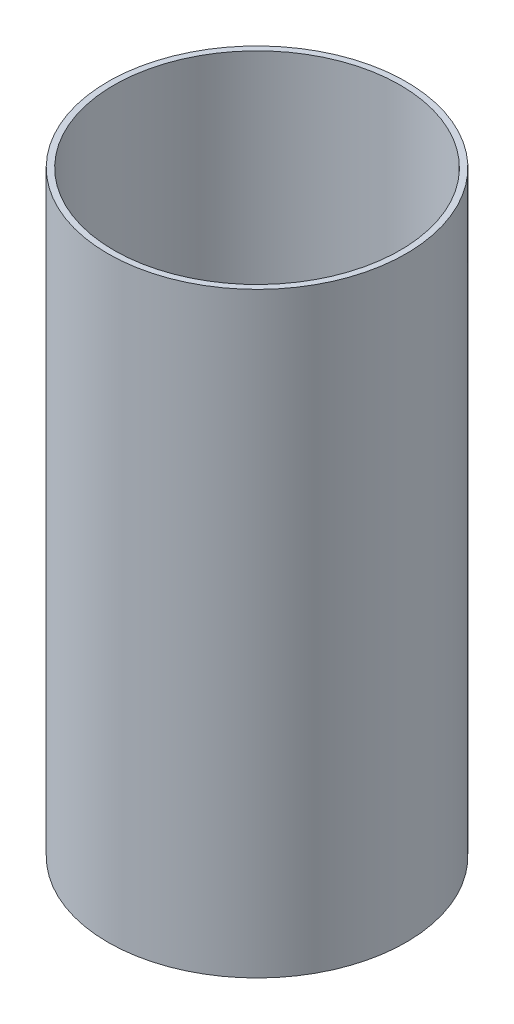
ISO-10303-21;
HEADER;
FILE_DESCRIPTION(('STEP AP214'),'2;1');
FILE_NAME('part.step','',(''),(''),'','','');
FILE_SCHEMA(('AUTOMOTIVE_DESIGN { 1 0 10303 214 1 1 1 1 }'));
ENDSEC;
DATA;
#1=APPLICATION_CONTEXT('core data for automotive mechanical design processes');
#2=APPLICATION_PROTOCOL_DEFINITION('international standard','automotive_design',2000,#1);
#3=PRODUCT_CONTEXT('',#1,'mechanical');
#4=PRODUCT('Part','Part','',(#3));
#5=PRODUCT_RELATED_PRODUCT_CATEGORY('part','',(#4));
#6=PRODUCT_DEFINITION_FORMATION('','',#4);
#7=PRODUCT_DEFINITION_CONTEXT('part definition',#1,'design');
#8=PRODUCT_DEFINITION('design','',#6,#7);
#9=PRODUCT_DEFINITION_SHAPE('','',#8);
#10=(LENGTH_UNIT() NAMED_UNIT(*) SI_UNIT(.MILLI.,.METRE.));
#11=(NAMED_UNIT(*) PLANE_ANGLE_UNIT() SI_UNIT($,.RADIAN.));
#12=(NAMED_UNIT(*) SI_UNIT($,.STERADIAN.) SOLID_ANGLE_UNIT());
#13=UNCERTAINTY_MEASURE_WITH_UNIT(LENGTH_MEASURE(1.E-05),#10,'distance_accuracy_value','');
#14=(GEOMETRIC_REPRESENTATION_CONTEXT(3) GLOBAL_UNCERTAINTY_ASSIGNED_CONTEXT((#13)) GLOBAL_UNIT_ASSIGNED_CONTEXT((#10,
#11,#12)) REPRESENTATION_CONTEXT('',''));
#15=CARTESIAN_POINT('',(0.,0.,0.));
#16=DIRECTION('',(0.,0.,1.));
#17=DIRECTION('',(1.,0.,0.));
#18=AXIS2_PLACEMENT_3D('',#15,#16,#17);
#19=CARTESIAN_POINT('',(0.,300.,0.));
#20=DIRECTION('',(0.,1.,0.));
#21=DIRECTION('',(0.,0.,1.));
#22=AXIS2_PLACEMENT_3D('',#19,#20,#21);
#23=PLANE('',#22);
#24=CARTESIAN_POINT('',(0.,300.,0.));
#25=DIRECTION('',(0.,1.,0.));
#26=DIRECTION('',(0.,0.,1.));
#27=AXIS2_PLACEMENT_3D('',#24,#25,#26);
#28=CIRCLE('',#27,75.);
#29=CARTESIAN_POINT('',(0.,300.,75.));
#30=VERTEX_POINT('',#29);
#31=EDGE_CURVE('E10',#30,#30,#28,.T.);
#32=ORIENTED_EDGE('',*,*,#31,.T.);
#33=EDGE_LOOP('',(#32));
#34=FACE_BOUND('',#33,.T.);
#35=CARTESIAN_POINT('',(0.,300.,0.));
#36=DIRECTION('',(0.,1.,0.));
#37=DIRECTION('',(0.,0.,1.));
#38=AXIS2_PLACEMENT_3D('',#35,#36,#37);
#39=CIRCLE('',#38,72.);
#40=CARTESIAN_POINT('',(0.,300.,72.));
#41=VERTEX_POINT('',#40);
#42=EDGE_CURVE('E46',#41,#41,#39,.T.);
#43=ORIENTED_EDGE('',*,*,#42,.F.);
#44=EDGE_LOOP('',(#43));
#45=FACE_BOUND('',#44,.T.);
#46=ADVANCED_FACE('F34',(#34,#45),#23,.T.);
#47=CARTESIAN_POINT('',(0.,0.,0.));
#48=DIRECTION('',(0.,1.,0.));
#49=DIRECTION('',(0.,0.,1.));
#50=AXIS2_PLACEMENT_3D('',#47,#48,#49);
#51=PLANE('',#50);
#52=CARTESIAN_POINT('',(0.,0.,0.));
#53=DIRECTION('',(0.,1.,0.));
#54=DIRECTION('',(0.,0.,1.));
#55=AXIS2_PLACEMENT_3D('',#52,#53,#54);
#56=CIRCLE('',#55,75.);
#57=CARTESIAN_POINT('',(0.,0.,75.));
#58=VERTEX_POINT('',#57);
#59=EDGE_CURVE('E38',#58,#58,#56,.T.);
#60=ORIENTED_EDGE('',*,*,#59,.F.);
#61=EDGE_LOOP('',(#60));
#62=FACE_BOUND('',#61,.T.);
#63=CARTESIAN_POINT('',(0.,0.,0.));
#64=DIRECTION('',(0.,1.,0.));
#65=DIRECTION('',(0.,0.,1.));
#66=AXIS2_PLACEMENT_3D('',#63,#64,#65);
#67=CIRCLE('',#66,72.);
#68=CARTESIAN_POINT('',(0.,0.,72.));
#69=VERTEX_POINT('',#68);
#70=EDGE_CURVE('E48',#69,#69,#67,.T.);
#71=ORIENTED_EDGE('',*,*,#70,.T.);
#72=EDGE_LOOP('',(#71));
#73=FACE_BOUND('',#72,.T.);
#74=ADVANCED_FACE('F59',(#62,#73),#51,.F.);
#75=CARTESIAN_POINT('',(0.,300.,0.));
#76=DIRECTION('',(0.,-1.,0.));
#77=DIRECTION('',(0.,0.,-1.));
#78=AXIS2_PLACEMENT_3D('',#75,#76,#77);
#79=CYLINDRICAL_SURFACE('',#78,75.);
#80=ORIENTED_EDGE('',*,*,#31,.F.);
#81=EDGE_LOOP('',(#80));
#82=FACE_BOUND('',#81,.T.);
#83=ORIENTED_EDGE('',*,*,#59,.T.);
#84=EDGE_LOOP('',(#83));
#85=FACE_BOUND('',#84,.T.);
#86=ADVANCED_FACE('F36',(#82,#85),#79,.T.);
#87=CARTESIAN_POINT('',(0.,300.,0.));
#88=DIRECTION('',(0.,-1.,0.));
#89=DIRECTION('',(0.,0.,-1.));
#90=AXIS2_PLACEMENT_3D('',#87,#88,#89);
#91=CYLINDRICAL_SURFACE('',#90,72.);
#92=ORIENTED_EDGE('',*,*,#42,.T.);
#93=EDGE_LOOP('',(#92));
#94=FACE_BOUND('',#93,.T.);
#95=ORIENTED_EDGE('',*,*,#70,.F.);
#96=EDGE_LOOP('',(#95));
#97=FACE_BOUND('',#96,.T.);
#98=ADVANCED_FACE('F55',(#94,#97),#91,.F.);
#99=CLOSED_SHELL('',(#46,#74,#86,#98));
#100=MANIFOLD_SOLID_BREP('B2',#99);
#101=ADVANCED_BREP_SHAPE_REPRESENTATION('',(#18,#100),#14);
#102=SHAPE_DEFINITION_REPRESENTATION(#9,#101);
ENDSEC;
END-ISO-10303-21;
